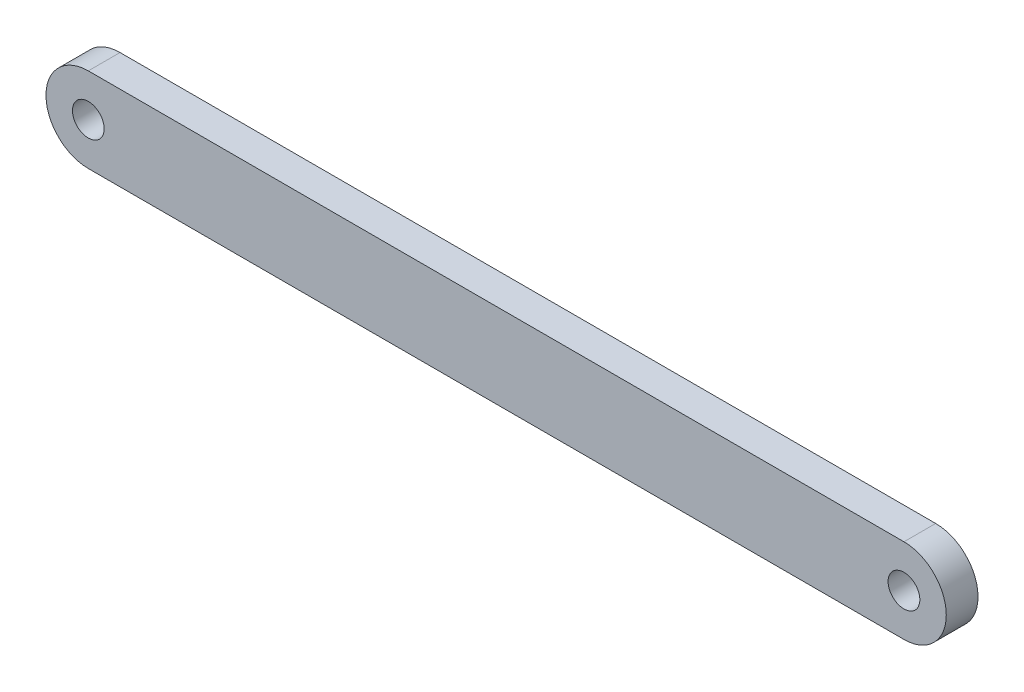
ISO-10303-21;
HEADER;
FILE_DESCRIPTION(('STEP AP214'),'2;1');
FILE_NAME('part.step','',(''),(''),'','','');
FILE_SCHEMA(('AUTOMOTIVE_DESIGN { 1 0 10303 214 1 1 1 1 }'));
ENDSEC;
DATA;
#1=APPLICATION_CONTEXT('core data for automotive mechanical design processes');
#2=APPLICATION_PROTOCOL_DEFINITION('international standard','automotive_design',2000,#1);
#3=PRODUCT_CONTEXT('',#1,'mechanical');
#4=PRODUCT('Part','Part','',(#3));
#5=PRODUCT_RELATED_PRODUCT_CATEGORY('part','',(#4));
#6=PRODUCT_DEFINITION_FORMATION('','',#4);
#7=PRODUCT_DEFINITION_CONTEXT('part definition',#1,'design');
#8=PRODUCT_DEFINITION('design','',#6,#7);
#9=PRODUCT_DEFINITION_SHAPE('','',#8);
#10=(LENGTH_UNIT() NAMED_UNIT(*) SI_UNIT(.MILLI.,.METRE.));
#11=(NAMED_UNIT(*) PLANE_ANGLE_UNIT() SI_UNIT($,.RADIAN.));
#12=(NAMED_UNIT(*) SI_UNIT($,.STERADIAN.) SOLID_ANGLE_UNIT());
#13=UNCERTAINTY_MEASURE_WITH_UNIT(LENGTH_MEASURE(1.E-05),#10,'distance_accuracy_value','');
#14=(GEOMETRIC_REPRESENTATION_CONTEXT(3) GLOBAL_UNCERTAINTY_ASSIGNED_CONTEXT((#13)) GLOBAL_UNIT_ASSIGNED_CONTEXT((#10,
#11,#12)) REPRESENTATION_CONTEXT('',''));
#15=CARTESIAN_POINT('',(0.,0.,0.));
#16=DIRECTION('',(0.,0.,1.));
#17=DIRECTION('',(1.,0.,0.));
#18=AXIS2_PLACEMENT_3D('',#15,#16,#17);
#19=CARTESIAN_POINT('',(0.,0.,4.7625));
#20=DIRECTION('',(0.,0.,1.));
#21=DIRECTION('',(1.,0.,0.));
#22=AXIS2_PLACEMENT_3D('',#19,#20,#21);
#23=PLANE('',#22);
#24=CARTESIAN_POINT('',(0.,0.,4.7625));
#25=DIRECTION('',(0.,0.,1.));
#26=DIRECTION('',(1.,0.,0.));
#27=AXIS2_PLACEMENT_3D('',#24,#25,#26);
#28=CIRCLE('',#27,2.38125);
#29=CARTESIAN_POINT('',(-2.38125,0.,4.7625));
#30=VERTEX_POINT('',#29);
#31=EDGE_CURVE('E100',#30,#30,#28,.T.);
#32=ORIENTED_EDGE('',*,*,#31,.F.);
#33=EDGE_LOOP('',(#32));
#34=FACE_BOUND('',#33,.T.);
#35=CARTESIAN_POINT('',(0.,0.,4.7625));
#36=DIRECTION('',(0.,0.,1.));
#37=DIRECTION('',(1.,0.,0.));
#38=AXIS2_PLACEMENT_3D('',#35,#36,#37);
#39=CIRCLE('',#38,6.35);
#40=CARTESIAN_POINT('',(0.,6.35,4.7625));
#41=VERTEX_POINT('',#40);
#42=CARTESIAN_POINT('',(0.,-6.35,4.7625));
#43=VERTEX_POINT('',#42);
#44=EDGE_CURVE('E85',#41,#43,#39,.T.);
#45=ORIENTED_EDGE('',*,*,#44,.T.);
#46=DIRECTION('',(1.,0.,0.));
#47=VECTOR('',#46,1.);
#48=CARTESIAN_POINT('',(0.,-6.35,4.7625));
#49=LINE('',#48,#47);
#50=CARTESIAN_POINT('',(122.428,-6.35,4.7625));
#51=VERTEX_POINT('',#50);
#52=EDGE_CURVE('E80',#43,#51,#49,.T.);
#53=ORIENTED_EDGE('',*,*,#52,.T.);
#54=CARTESIAN_POINT('',(122.428,0.,4.7625));
#55=DIRECTION('',(0.,0.,1.));
#56=DIRECTION('',(1.,0.,0.));
#57=AXIS2_PLACEMENT_3D('',#54,#55,#56);
#58=CIRCLE('',#57,6.35);
#59=CARTESIAN_POINT('',(122.428,6.35,4.7625));
#60=VERTEX_POINT('',#59);
#61=EDGE_CURVE('E83',#51,#60,#58,.T.);
#62=ORIENTED_EDGE('',*,*,#61,.T.);
#63=DIRECTION('',(-1.,0.,0.));
#64=VECTOR('',#63,1.);
#65=CARTESIAN_POINT('',(0.,6.35,4.7625));
#66=LINE('',#65,#64);
#67=EDGE_CURVE('E50',#60,#41,#66,.T.);
#68=ORIENTED_EDGE('',*,*,#67,.T.);
#69=EDGE_LOOP('',(#45,#53,#62,#68));
#70=FACE_BOUND('',#69,.T.);
#71=CARTESIAN_POINT('',(122.428,0.,4.7625));
#72=DIRECTION('',(0.,0.,1.));
#73=DIRECTION('',(1.,0.,0.));
#74=AXIS2_PLACEMENT_3D('',#71,#72,#73);
#75=CIRCLE('',#74,2.38125000000001);
#76=CARTESIAN_POINT('',(120.04675,0.,4.7625));
#77=VERTEX_POINT('',#76);
#78=EDGE_CURVE('E115',#77,#77,#75,.T.);
#79=ORIENTED_EDGE('',*,*,#78,.F.);
#80=EDGE_LOOP('',(#79));
#81=FACE_BOUND('',#80,.T.);
#82=ADVANCED_FACE('F33',(#34,#70,#81),#23,.T.);
#83=CARTESIAN_POINT('',(0.,0.,0.));
#84=DIRECTION('',(0.,0.,1.));
#85=DIRECTION('',(1.,0.,0.));
#86=AXIS2_PLACEMENT_3D('',#83,#84,#85);
#87=PLANE('',#86);
#88=CARTESIAN_POINT('',(0.,0.,0.));
#89=DIRECTION('',(0.,0.,1.));
#90=DIRECTION('',(1.,0.,0.));
#91=AXIS2_PLACEMENT_3D('',#88,#89,#90);
#92=CIRCLE('',#91,6.35);
#93=CARTESIAN_POINT('',(0.,6.35,0.));
#94=VERTEX_POINT('',#93);
#95=CARTESIAN_POINT('',(0.,-6.35,0.));
#96=VERTEX_POINT('',#95);
#97=EDGE_CURVE('E97',#94,#96,#92,.T.);
#98=ORIENTED_EDGE('',*,*,#97,.F.);
#99=DIRECTION('',(-1.,0.,0.));
#100=VECTOR('',#99,1.);
#101=CARTESIAN_POINT('',(0.,6.35,0.));
#102=LINE('',#101,#100);
#103=CARTESIAN_POINT('',(122.428,6.35,0.));
#104=VERTEX_POINT('',#103);
#105=EDGE_CURVE('E73',#104,#94,#102,.T.);
#106=ORIENTED_EDGE('',*,*,#105,.F.);
#107=CARTESIAN_POINT('',(122.428,0.,0.));
#108=DIRECTION('',(0.,0.,1.));
#109=DIRECTION('',(1.,0.,0.));
#110=AXIS2_PLACEMENT_3D('',#107,#108,#109);
#111=CIRCLE('',#110,6.35);
#112=CARTESIAN_POINT('',(122.428,-6.35,0.));
#113=VERTEX_POINT('',#112);
#114=EDGE_CURVE('E67',#113,#104,#111,.T.);
#115=ORIENTED_EDGE('',*,*,#114,.F.);
#116=DIRECTION('',(1.,0.,0.));
#117=VECTOR('',#116,1.);
#118=CARTESIAN_POINT('',(0.,-6.35,0.));
#119=LINE('',#118,#117);
#120=EDGE_CURVE('E89',#96,#113,#119,.T.);
#121=ORIENTED_EDGE('',*,*,#120,.F.);
#122=EDGE_LOOP('',(#98,#106,#115,#121));
#123=FACE_BOUND('',#122,.T.);
#124=CARTESIAN_POINT('',(0.,0.,0.));
#125=DIRECTION('',(0.,0.,1.));
#126=DIRECTION('',(1.,0.,0.));
#127=AXIS2_PLACEMENT_3D('',#124,#125,#126);
#128=CIRCLE('',#127,2.38125);
#129=CARTESIAN_POINT('',(-2.38125,0.,0.));
#130=VERTEX_POINT('',#129);
#131=EDGE_CURVE('E112',#130,#130,#128,.T.);
#132=ORIENTED_EDGE('',*,*,#131,.T.);
#133=EDGE_LOOP('',(#132));
#134=FACE_BOUND('',#133,.T.);
#135=CARTESIAN_POINT('',(122.428,0.,0.));
#136=DIRECTION('',(0.,0.,1.));
#137=DIRECTION('',(1.,0.,0.));
#138=AXIS2_PLACEMENT_3D('',#135,#136,#137);
#139=CIRCLE('',#138,2.38125000000001);
#140=CARTESIAN_POINT('',(120.04675,0.,0.));
#141=VERTEX_POINT('',#140);
#142=EDGE_CURVE('E118',#141,#141,#139,.T.);
#143=ORIENTED_EDGE('',*,*,#142,.T.);
#144=EDGE_LOOP('',(#143));
#145=FACE_BOUND('',#144,.T.);
#146=ADVANCED_FACE('F108',(#123,#134,#145),#87,.F.);
#147=CARTESIAN_POINT('',(0.,0.,4.7625));
#148=DIRECTION('',(0.,0.,-1.));
#149=DIRECTION('',(-1.,0.,0.));
#150=AXIS2_PLACEMENT_3D('',#147,#148,#149);
#151=CYLINDRICAL_SURFACE('',#150,6.35);
#152=ORIENTED_EDGE('',*,*,#97,.T.);
#153=DIRECTION('',(0.,0.,-1.));
#154=VECTOR('',#153,1.);
#155=CARTESIAN_POINT('',(0.,-6.35,4.7625));
#156=LINE('',#155,#154);
#157=EDGE_CURVE('E11',#43,#96,#156,.T.);
#158=ORIENTED_EDGE('',*,*,#157,.F.);
#159=ORIENTED_EDGE('',*,*,#44,.F.);
#160=DIRECTION('',(0.,0.,-1.));
#161=VECTOR('',#160,1.);
#162=CARTESIAN_POINT('',(0.,6.35,4.7625));
#163=LINE('',#162,#161);
#164=EDGE_CURVE('E93',#41,#94,#163,.T.);
#165=ORIENTED_EDGE('',*,*,#164,.T.);
#166=EDGE_LOOP('',(#152,#158,#159,#165));
#167=FACE_BOUND('',#166,.T.);
#168=ADVANCED_FACE('F35',(#167),#151,.T.);
#169=CARTESIAN_POINT('',(0.,-6.35,4.7625));
#170=DIRECTION('',(0.,1.,0.));
#171=DIRECTION('',(0.,0.,1.));
#172=AXIS2_PLACEMENT_3D('',#169,#170,#171);
#173=PLANE('',#172);
#174=ORIENTED_EDGE('',*,*,#120,.T.);
#175=DIRECTION('',(0.,0.,-1.));
#176=VECTOR('',#175,1.);
#177=CARTESIAN_POINT('',(122.428,-6.35,4.7625));
#178=LINE('',#177,#176);
#179=EDGE_CURVE('E42',#51,#113,#178,.T.);
#180=ORIENTED_EDGE('',*,*,#179,.F.);
#181=ORIENTED_EDGE('',*,*,#52,.F.);
#182=ORIENTED_EDGE('',*,*,#157,.T.);
#183=EDGE_LOOP('',(#174,#180,#181,#182));
#184=FACE_BOUND('',#183,.T.);
#185=ADVANCED_FACE('F88',(#184),#173,.F.);
#186=CARTESIAN_POINT('',(122.428,0.,4.7625));
#187=DIRECTION('',(0.,0.,-1.));
#188=DIRECTION('',(-1.,0.,0.));
#189=AXIS2_PLACEMENT_3D('',#186,#187,#188);
#190=CYLINDRICAL_SURFACE('',#189,6.35);
#191=ORIENTED_EDGE('',*,*,#114,.T.);
#192=DIRECTION('',(0.,0.,-1.));
#193=VECTOR('',#192,1.);
#194=CARTESIAN_POINT('',(122.428,6.35,4.7625));
#195=LINE('',#194,#193);
#196=EDGE_CURVE('E90',#60,#104,#195,.T.);
#197=ORIENTED_EDGE('',*,*,#196,.F.);
#198=ORIENTED_EDGE('',*,*,#61,.F.);
#199=ORIENTED_EDGE('',*,*,#179,.T.);
#200=EDGE_LOOP('',(#191,#197,#198,#199));
#201=FACE_BOUND('',#200,.T.);
#202=ADVANCED_FACE('F91',(#201),#190,.T.);
#203=CARTESIAN_POINT('',(0.,6.35,4.7625));
#204=DIRECTION('',(0.,-1.,0.));
#205=DIRECTION('',(0.,0.,-1.));
#206=AXIS2_PLACEMENT_3D('',#203,#204,#205);
#207=PLANE('',#206);
#208=ORIENTED_EDGE('',*,*,#105,.T.);
#209=ORIENTED_EDGE('',*,*,#164,.F.);
#210=ORIENTED_EDGE('',*,*,#67,.F.);
#211=ORIENTED_EDGE('',*,*,#196,.T.);
#212=EDGE_LOOP('',(#208,#209,#210,#211));
#213=FACE_BOUND('',#212,.T.);
#214=ADVANCED_FACE('F105',(#213),#207,.F.);
#215=CARTESIAN_POINT('',(0.,0.,4.7625));
#216=DIRECTION('',(0.,0.,-1.));
#217=DIRECTION('',(-1.,0.,0.));
#218=AXIS2_PLACEMENT_3D('',#215,#216,#217);
#219=CYLINDRICAL_SURFACE('',#218,2.38125);
#220=CARTESIAN_POINT('',(-2.38125,0.,4.7625));
#221=CARTESIAN_POINT('',(-2.38125,0.,4.712890625));
#222=CARTESIAN_POINT('',(-2.38125,0.,4.66328125));
#223=CARTESIAN_POINT('',(-2.38125,0.,4.5640625));
#224=CARTESIAN_POINT('',(-2.38125,0.,4.514453125));
#225=CARTESIAN_POINT('',(-2.38125,0.,4.415234375));
#226=CARTESIAN_POINT('',(-2.38125,0.,4.365625));
#227=CARTESIAN_POINT('',(-2.38125,0.,4.26640625));
#228=CARTESIAN_POINT('',(-2.38125,0.,4.216796875));
#229=CARTESIAN_POINT('',(-2.38125,0.,4.117578125));
#230=CARTESIAN_POINT('',(-2.38125,0.,4.06796875));
#231=CARTESIAN_POINT('',(-2.38125,0.,3.96875));
#232=CARTESIAN_POINT('',(-2.38125,0.,3.919140625));
#233=CARTESIAN_POINT('',(-2.38125,0.,3.819921875));
#234=CARTESIAN_POINT('',(-2.38125,0.,3.7703125));
#235=CARTESIAN_POINT('',(-2.38125,0.,3.67109375));
#236=CARTESIAN_POINT('',(-2.38125,0.,3.621484375));
#237=CARTESIAN_POINT('',(-2.38125,0.,3.522265625));
#238=CARTESIAN_POINT('',(-2.38125,0.,3.47265625));
#239=CARTESIAN_POINT('',(-2.38125,0.,3.3734375));
#240=CARTESIAN_POINT('',(-2.38125,0.,3.323828125));
#241=CARTESIAN_POINT('',(-2.38125,0.,3.224609375));
#242=CARTESIAN_POINT('',(-2.38125,0.,3.175));
#243=CARTESIAN_POINT('',(-2.38125,0.,3.07578125));
#244=CARTESIAN_POINT('',(-2.38125,0.,3.026171875));
#245=CARTESIAN_POINT('',(-2.38125,0.,2.926953125));
#246=CARTESIAN_POINT('',(-2.38125,0.,2.87734375));
#247=CARTESIAN_POINT('',(-2.38125,0.,2.778125));
#248=CARTESIAN_POINT('',(-2.38125,0.,2.728515625));
#249=CARTESIAN_POINT('',(-2.38125,0.,2.629296875));
#250=CARTESIAN_POINT('',(-2.38125,0.,2.5796875));
#251=CARTESIAN_POINT('',(-2.38125,0.,2.48046875));
#252=CARTESIAN_POINT('',(-2.38125,0.,2.430859375));
#253=CARTESIAN_POINT('',(-2.38125,0.,2.331640625));
#254=CARTESIAN_POINT('',(-2.38125,0.,2.28203125));
#255=CARTESIAN_POINT('',(-2.38125,0.,2.1828125));
#256=CARTESIAN_POINT('',(-2.38125,0.,2.133203125));
#257=CARTESIAN_POINT('',(-2.38125,0.,2.033984375));
#258=CARTESIAN_POINT('',(-2.38125,0.,1.984375));
#259=CARTESIAN_POINT('',(-2.38125,0.,1.88515625));
#260=CARTESIAN_POINT('',(-2.38125,0.,1.835546875));
#261=CARTESIAN_POINT('',(-2.38125,0.,1.736328125));
#262=CARTESIAN_POINT('',(-2.38125,0.,1.68671875));
#263=CARTESIAN_POINT('',(-2.38125,0.,1.5875));
#264=CARTESIAN_POINT('',(-2.38125,0.,1.537890625));
#265=CARTESIAN_POINT('',(-2.38125,0.,1.438671875));
#266=CARTESIAN_POINT('',(-2.38125,0.,1.3890625));
#267=CARTESIAN_POINT('',(-2.38125,0.,1.28984375));
#268=CARTESIAN_POINT('',(-2.38125,0.,1.240234375));
#269=CARTESIAN_POINT('',(-2.38125,0.,1.141015625));
#270=CARTESIAN_POINT('',(-2.38125,0.,1.09140625));
#271=CARTESIAN_POINT('',(-2.38125,0.,0.992187499999999));
#272=CARTESIAN_POINT('',(-2.38125,0.,0.942578124999999));
#273=CARTESIAN_POINT('',(-2.38125,0.,0.843359375));
#274=CARTESIAN_POINT('',(-2.38125,0.,0.79375));
#275=CARTESIAN_POINT('',(-2.38125,0.,0.69453125));
#276=CARTESIAN_POINT('',(-2.38125,0.,0.644921875));
#277=CARTESIAN_POINT('',(-2.38125,0.,0.545703125));
#278=CARTESIAN_POINT('',(-2.38125,0.,0.49609375));
#279=CARTESIAN_POINT('',(-2.38125,0.,0.396875));
#280=CARTESIAN_POINT('',(-2.38125,0.,0.347265625));
#281=CARTESIAN_POINT('',(-2.38125,0.,0.248046875));
#282=CARTESIAN_POINT('',(-2.38125,0.,0.1984375));
#283=CARTESIAN_POINT('',(-2.38125,0.,0.09921875));
#284=CARTESIAN_POINT('',(-2.38125,0.,0.049609375));
#285=CARTESIAN_POINT('',(-2.38125,0.,0.));
#286=B_SPLINE_CURVE_WITH_KNOTS('',3,(#220,#221,#222,#223,#224,#225,#226,#227,#228,#229,#230,
#231,#232,#233,#234,#235,#236,#237,#238,#239,#240,#241,#242,#243,#244,#245,#246,#247,#248,#249,
#250,#251,#252,#253,#254,#255,#256,#257,#258,#259,#260,#261,#262,#263,#264,#265,#266,#267,#268,
#269,#270,#271,#272,#273,#274,#275,#276,#277,#278,#279,#280,#281,#282,#283,#284,#285),
.UNSPECIFIED.,.F.,.F.,(4,2,2,2,2,2,2,2,2,2,2,2,2,2,2,2,2,2,2,2,2,2,2,2,2,2,2,2,2,2,2,2,4),(0.,
0.148828125,0.29765625,0.446484375,0.5953125,0.744140625,0.892968750000001,1.041796875,1.190625,
1.339453125,1.48828125,1.637109375,1.7859375,1.934765625,2.08359375,2.232421875,2.38125,
2.530078125,2.67890625,2.827734375,2.9765625,3.125390625,3.27421875,3.423046875,3.571875,
3.720703125,3.86953125,4.018359375,4.1671875,4.316015625,4.46484375,4.613671875,4.7625),.UNSPECIFIED.);
#287=EDGE_CURVE('BSEAM135',#30,#130,#286,.T.);
#288=ORIENTED_EDGE('',*,*,#31,.T.);
#289=ORIENTED_EDGE('',*,*,#131,.F.);
#290=ORIENTED_EDGE('',*,*,#287,.T.);
#291=ORIENTED_EDGE('',*,*,#287,.F.);
#292=EDGE_LOOP('',(#288,#290,#289,#291));
#293=FACE_BOUND('',#292,.T.);
#294=ADVANCED_FACE('F135',(#293),#219,.F.);
#295=CARTESIAN_POINT('',(122.428,0.,4.7625));
#296=DIRECTION('',(0.,0.,-1.));
#297=DIRECTION('',(-1.,0.,0.));
#298=AXIS2_PLACEMENT_3D('',#295,#296,#297);
#299=CYLINDRICAL_SURFACE('',#298,2.38125000000001);
#300=CARTESIAN_POINT('',(120.04675,0.,4.7625));
#301=CARTESIAN_POINT('',(120.04675,0.,4.712890625));
#302=CARTESIAN_POINT('',(120.04675,0.,4.66328125));
#303=CARTESIAN_POINT('',(120.04675,0.,4.5640625));
#304=CARTESIAN_POINT('',(120.04675,0.,4.514453125));
#305=CARTESIAN_POINT('',(120.04675,0.,4.415234375));
#306=CARTESIAN_POINT('',(120.04675,0.,4.365625));
#307=CARTESIAN_POINT('',(120.04675,0.,4.26640625));
#308=CARTESIAN_POINT('',(120.04675,0.,4.216796875));
#309=CARTESIAN_POINT('',(120.04675,0.,4.117578125));
#310=CARTESIAN_POINT('',(120.04675,0.,4.06796875));
#311=CARTESIAN_POINT('',(120.04675,0.,3.96875));
#312=CARTESIAN_POINT('',(120.04675,0.,3.919140625));
#313=CARTESIAN_POINT('',(120.04675,0.,3.819921875));
#314=CARTESIAN_POINT('',(120.04675,0.,3.7703125));
#315=CARTESIAN_POINT('',(120.04675,0.,3.67109375));
#316=CARTESIAN_POINT('',(120.04675,0.,3.621484375));
#317=CARTESIAN_POINT('',(120.04675,0.,3.522265625));
#318=CARTESIAN_POINT('',(120.04675,0.,3.47265625));
#319=CARTESIAN_POINT('',(120.04675,0.,3.3734375));
#320=CARTESIAN_POINT('',(120.04675,0.,3.323828125));
#321=CARTESIAN_POINT('',(120.04675,0.,3.224609375));
#322=CARTESIAN_POINT('',(120.04675,0.,3.175));
#323=CARTESIAN_POINT('',(120.04675,0.,3.07578125));
#324=CARTESIAN_POINT('',(120.04675,0.,3.026171875));
#325=CARTESIAN_POINT('',(120.04675,0.,2.926953125));
#326=CARTESIAN_POINT('',(120.04675,0.,2.87734375));
#327=CARTESIAN_POINT('',(120.04675,0.,2.778125));
#328=CARTESIAN_POINT('',(120.04675,0.,2.728515625));
#329=CARTESIAN_POINT('',(120.04675,0.,2.629296875));
#330=CARTESIAN_POINT('',(120.04675,0.,2.5796875));
#331=CARTESIAN_POINT('',(120.04675,0.,2.48046875));
#332=CARTESIAN_POINT('',(120.04675,0.,2.430859375));
#333=CARTESIAN_POINT('',(120.04675,0.,2.331640625));
#334=CARTESIAN_POINT('',(120.04675,0.,2.28203125));
#335=CARTESIAN_POINT('',(120.04675,0.,2.1828125));
#336=CARTESIAN_POINT('',(120.04675,0.,2.133203125));
#337=CARTESIAN_POINT('',(120.04675,0.,2.033984375));
#338=CARTESIAN_POINT('',(120.04675,0.,1.984375));
#339=CARTESIAN_POINT('',(120.04675,0.,1.88515625));
#340=CARTESIAN_POINT('',(120.04675,0.,1.835546875));
#341=CARTESIAN_POINT('',(120.04675,0.,1.736328125));
#342=CARTESIAN_POINT('',(120.04675,0.,1.68671875));
#343=CARTESIAN_POINT('',(120.04675,0.,1.5875));
#344=CARTESIAN_POINT('',(120.04675,0.,1.537890625));
#345=CARTESIAN_POINT('',(120.04675,0.,1.438671875));
#346=CARTESIAN_POINT('',(120.04675,0.,1.3890625));
#347=CARTESIAN_POINT('',(120.04675,0.,1.28984375));
#348=CARTESIAN_POINT('',(120.04675,0.,1.240234375));
#349=CARTESIAN_POINT('',(120.04675,0.,1.141015625));
#350=CARTESIAN_POINT('',(120.04675,0.,1.09140625));
#351=CARTESIAN_POINT('',(120.04675,0.,0.992187499999999));
#352=CARTESIAN_POINT('',(120.04675,0.,0.942578124999999));
#353=CARTESIAN_POINT('',(120.04675,0.,0.843359375));
#354=CARTESIAN_POINT('',(120.04675,0.,0.79375));
#355=CARTESIAN_POINT('',(120.04675,0.,0.69453125));
#356=CARTESIAN_POINT('',(120.04675,0.,0.644921875));
#357=CARTESIAN_POINT('',(120.04675,0.,0.545703125));
#358=CARTESIAN_POINT('',(120.04675,0.,0.49609375));
#359=CARTESIAN_POINT('',(120.04675,0.,0.396875));
#360=CARTESIAN_POINT('',(120.04675,0.,0.347265625));
#361=CARTESIAN_POINT('',(120.04675,0.,0.248046875));
#362=CARTESIAN_POINT('',(120.04675,0.,0.1984375));
#363=CARTESIAN_POINT('',(120.04675,0.,0.09921875));
#364=CARTESIAN_POINT('',(120.04675,0.,0.049609375));
#365=CARTESIAN_POINT('',(120.04675,0.,0.));
#366=B_SPLINE_CURVE_WITH_KNOTS('',3,(#300,#301,#302,#303,#304,#305,#306,#307,#308,#309,#310,
#311,#312,#313,#314,#315,#316,#317,#318,#319,#320,#321,#322,#323,#324,#325,#326,#327,#328,#329,
#330,#331,#332,#333,#334,#335,#336,#337,#338,#339,#340,#341,#342,#343,#344,#345,#346,#347,#348,
#349,#350,#351,#352,#353,#354,#355,#356,#357,#358,#359,#360,#361,#362,#363,#364,#365),
.UNSPECIFIED.,.F.,.F.,(4,2,2,2,2,2,2,2,2,2,2,2,2,2,2,2,2,2,2,2,2,2,2,2,2,2,2,2,2,2,2,2,4),(0.,
0.148828125,0.29765625,0.446484375,0.5953125,0.744140625,0.892968750000001,1.041796875,1.190625,
1.339453125,1.48828125,1.637109375,1.7859375,1.934765625,2.08359375,2.232421875,2.38125,
2.530078125,2.67890625,2.827734375,2.9765625,3.125390625,3.27421875,3.423046875,3.571875,
3.720703125,3.86953125,4.018359375,4.1671875,4.316015625,4.46484375,4.613671875,4.7625),.UNSPECIFIED.);
#367=EDGE_CURVE('BSEAM124',#77,#141,#366,.T.);
#368=ORIENTED_EDGE('',*,*,#78,.T.);
#369=ORIENTED_EDGE('',*,*,#142,.F.);
#370=ORIENTED_EDGE('',*,*,#367,.T.);
#371=ORIENTED_EDGE('',*,*,#367,.F.);
#372=EDGE_LOOP('',(#368,#370,#369,#371));
#373=FACE_BOUND('',#372,.T.);
#374=ADVANCED_FACE('F124',(#373),#299,.F.);
#375=CLOSED_SHELL('',(#82,#146,#168,#185,#202,#214,#294,#374));
#376=MANIFOLD_SOLID_BREP('B2',#375);
#377=ADVANCED_BREP_SHAPE_REPRESENTATION('',(#18,#376),#14);
#378=SHAPE_DEFINITION_REPRESENTATION(#9,#377);
ENDSEC;
END-ISO-10303-21;
